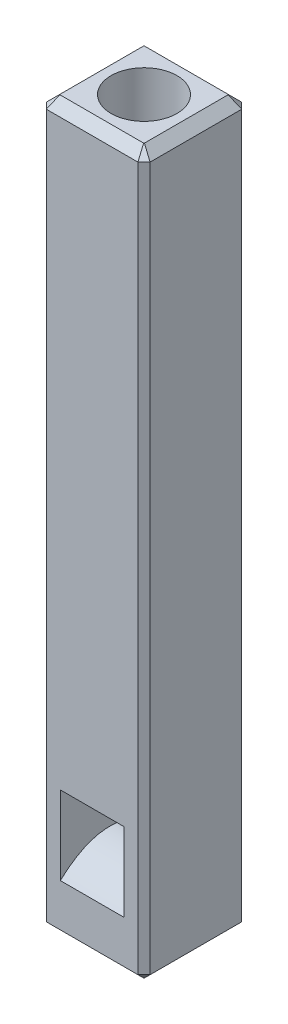
ISO-10303-21;
HEADER;
FILE_DESCRIPTION(('STEP AP214'),'2;1');
FILE_NAME('part.step','',(''),(''),'','','');
FILE_SCHEMA(('AUTOMOTIVE_DESIGN { 1 0 10303 214 1 1 1 1 }'));
ENDSEC;
DATA;
#1=APPLICATION_CONTEXT('core data for automotive mechanical design processes');
#2=APPLICATION_PROTOCOL_DEFINITION('international standard','automotive_design',2000,#1);
#3=PRODUCT_CONTEXT('',#1,'mechanical');
#4=PRODUCT('Part','Part','',(#3));
#5=PRODUCT_RELATED_PRODUCT_CATEGORY('part','',(#4));
#6=PRODUCT_DEFINITION_FORMATION('','',#4);
#7=PRODUCT_DEFINITION_CONTEXT('part definition',#1,'design');
#8=PRODUCT_DEFINITION('design','',#6,#7);
#9=PRODUCT_DEFINITION_SHAPE('','',#8);
#10=(LENGTH_UNIT() NAMED_UNIT(*) SI_UNIT(.MILLI.,.METRE.));
#11=(NAMED_UNIT(*) PLANE_ANGLE_UNIT() SI_UNIT($,.RADIAN.));
#12=(NAMED_UNIT(*) SI_UNIT($,.STERADIAN.) SOLID_ANGLE_UNIT());
#13=UNCERTAINTY_MEASURE_WITH_UNIT(LENGTH_MEASURE(1.E-05),#10,'distance_accuracy_value','');
#14=(GEOMETRIC_REPRESENTATION_CONTEXT(3) GLOBAL_UNCERTAINTY_ASSIGNED_CONTEXT((#13)) GLOBAL_UNIT_ASSIGNED_CONTEXT((#10,
#11,#12)) REPRESENTATION_CONTEXT('',''));
#15=CARTESIAN_POINT('',(0.,0.,0.));
#16=DIRECTION('',(0.,0.,1.));
#17=DIRECTION('',(1.,0.,0.));
#18=AXIS2_PLACEMENT_3D('',#15,#16,#17);
#19=CARTESIAN_POINT('',(135.398328279042,93.0902225420057,2.20725238524841));
#20=DIRECTION('',(-1.,0.,0.));
#21=DIRECTION('',(0.,0.,1.));
#22=AXIS2_PLACEMENT_3D('',#19,#20,#21);
#23=PLANE('',#22);
#24=DIRECTION('',(0.,-1.,0.));
#25=VECTOR('',#24,1.);
#26=CARTESIAN_POINT('',(135.398328279042,89.5067604238917,4.30641993807596));
#27=LINE('',#26,#25);
#28=CARTESIAN_POINT('',(135.398328279042,89.5067604238916,4.30641993807598));
#29=VERTEX_POINT('',#28);
#30=CARTESIAN_POINT('',(135.398328279042,57.2721392427519,4.30641993807597));
#31=VERTEX_POINT('',#30);
#32=EDGE_CURVE('E11',#29,#31,#27,.T.);
#33=ORIENTED_EDGE('',*,*,#32,.F.);
#34=DIRECTION('',(0.,0.,1.));
#35=VECTOR('',#34,1.);
#36=CARTESIAN_POINT('',(135.398328279042,89.5067604238916,0.108084832420845));
#37=LINE('',#36,#35);
#38=CARTESIAN_POINT('',(135.398328279042,89.5067604238917,0.108084832420809));
#39=VERTEX_POINT('',#38);
#40=EDGE_CURVE('E347',#39,#29,#37,.T.);
#41=ORIENTED_EDGE('',*,*,#40,.F.);
#42=DIRECTION('',(0.,1.,0.));
#43=VECTOR('',#42,1.);
#44=CARTESIAN_POINT('',(135.398328279042,57.2721392427519,0.108084832420827));
#45=LINE('',#44,#43);
#46=CARTESIAN_POINT('',(135.398328279042,57.2721392427518,0.108084832420818));
#47=VERTEX_POINT('',#46);
#48=EDGE_CURVE('E223',#47,#39,#45,.T.);
#49=ORIENTED_EDGE('',*,*,#48,.F.);
#50=DIRECTION('',(0.,0.,-1.));
#51=VECTOR('',#50,1.);
#52=CARTESIAN_POINT('',(135.398328279042,57.2721392427519,4.30641993807597));
#53=LINE('',#52,#51);
#54=EDGE_CURVE('E239',#31,#47,#53,.T.);
#55=ORIENTED_EDGE('',*,*,#54,.F.);
#56=EDGE_LOOP('',(#33,#41,#49,#55));
#57=FACE_BOUND('',#56,.T.);
#58=ADVANCED_FACE('F16',(#57),#23,.T.);
#59=CARTESIAN_POINT('',(135.537536147664,53.6886771246379,4.44507546716855));
#60=DIRECTION('',(-0.70569979329208,0.,0.708510975036743));
#61=DIRECTION('',(0.,1.,0.));
#62=AXIS2_PLACEMENT_3D('',#59,#60,#61);
#63=PLANE('',#62);
#64=DIRECTION('',(0.,-1.,0.));
#65=VECTOR('',#64,1.);
#66=CARTESIAN_POINT('',(135.676744016287,89.5067604238917,4.58373099626115));
#67=LINE('',#66,#65);
#68=CARTESIAN_POINT('',(135.676744016287,89.5067604238917,4.58373099626115));
#69=VERTEX_POINT('',#68);
#70=CARTESIAN_POINT('',(135.676744016287,57.2721392427519,4.58373099626115));
#71=VERTEX_POINT('',#70);
#72=EDGE_CURVE('E266',#69,#71,#67,.T.);
#73=ORIENTED_EDGE('',*,*,#72,.F.);
#74=DIRECTION('',(0.708510975036784,0.,0.705699793292039));
#75=VECTOR('',#74,1.);
#76=CARTESIAN_POINT('',(135.398328279042,89.5067604238918,4.30641993807601));
#77=LINE('',#76,#75);
#78=EDGE_CURVE('E367',#29,#69,#77,.T.);
#79=ORIENTED_EDGE('',*,*,#78,.F.);
#80=ORIENTED_EDGE('',*,*,#32,.T.);
#81=DIRECTION('',(-0.708510975036768,0.,-0.705699793292055));
#82=VECTOR('',#81,1.);
#83=CARTESIAN_POINT('',(135.676744016287,57.2721392427519,4.58373099626118));
#84=LINE('',#83,#82);
#85=EDGE_CURVE('E27',#71,#31,#84,.T.);
#86=ORIENTED_EDGE('',*,*,#85,.F.);
#87=EDGE_LOOP('',(#73,#79,#80,#86));
#88=FACE_BOUND('',#87,.T.);
#89=ADVANCED_FACE('F509',(#88),#63,.T.);
#90=CARTESIAN_POINT('',(136.518880517288,56.6939146420422,4.60641371330662));
#91=DIRECTION('',(-0.499005109318785,-0.70710678118654,0.500992914993574));
#92=DIRECTION('',(-0.817038130343771,0.576583639695365,0.));
#93=AXIS2_PLACEMENT_3D('',#90,#91,#92);
#94=PLANE('',#93);
#95=ORIENTED_EDGE('',*,*,#85,.T.);
#96=DIRECTION('',(-0.678447398917275,0.678447398917289,0.281812444375241));
#97=VECTOR('',#96,1.);
#98=CARTESIAN_POINT('',(135.840258274913,56.8302092468804,4.12285173134683));
#99=LINE('',#98,#97);
#100=CARTESIAN_POINT('',(135.840258274913,56.8302092468804,4.12285173134683));
#101=VERTEX_POINT('',#100);
#102=EDGE_CURVE('E235',#101,#31,#99,.T.);
#103=ORIENTED_EDGE('',*,*,#102,.F.);
#104=DIRECTION('',(-0.708510975037079,0.,-0.705699793291742));
#105=VECTOR('',#104,1.);
#106=CARTESIAN_POINT('',(135.859283029084,56.8302092468804,4.14180100038966));
#107=LINE('',#106,#105);
#108=CARTESIAN_POINT('',(135.859283029084,56.8302092468804,4.14180100038962));
#109=VERTEX_POINT('',#108);
#110=EDGE_CURVE('E258',#109,#101,#107,.T.);
#111=ORIENTED_EDGE('',*,*,#110,.F.);
#112=DIRECTION('',(0.280356945350055,-0.678748842796064,-0.678748842796059));
#113=VECTOR('',#112,1.);
#114=CARTESIAN_POINT('',(135.676744016287,57.2721392427519,4.58373099626112));
#115=LINE('',#114,#113);
#116=EDGE_CURVE('E171',#71,#109,#115,.T.);
#117=ORIENTED_EDGE('',*,*,#116,.F.);
#118=EDGE_LOOP('',(#95,#103,#111,#117));
#119=FACE_BOUND('',#118,.T.);
#120=ADVANCED_FACE('F373',(#119),#94,.T.);
#121=CARTESIAN_POINT('',(135.619293276977,57.0511742448162,5.08625344864147));
#122=DIRECTION('',(-0.707106781186551,-0.707106781186544,0.));
#123=DIRECTION('',(-0.707106781186544,0.707106781186551,0.));
#124=AXIS2_PLACEMENT_3D('',#121,#122,#123);
#125=PLANE('',#124);
#126=ORIENTED_EDGE('',*,*,#54,.T.);
#127=DIRECTION('',(-0.678598344545849,0.678598344545856,-0.281084637714793));
#128=VECTOR('',#127,1.);
#129=CARTESIAN_POINT('',(135.840258274913,56.8302092468803,0.291138230330263));
#130=LINE('',#129,#128);
#131=CARTESIAN_POINT('',(135.840258274913,56.8302092468803,0.291138230330263));
#132=VERTEX_POINT('',#131);
#133=EDGE_CURVE('E220',#132,#47,#130,.T.);
#134=ORIENTED_EDGE('',*,*,#133,.F.);
#135=DIRECTION('',(0.,0.,-1.));
#136=VECTOR('',#135,1.);
#137=CARTESIAN_POINT('',(135.840258274913,56.8302092468804,4.12285173134683));
#138=LINE('',#137,#136);
#139=EDGE_CURVE('E255',#101,#132,#138,.T.);
#140=ORIENTED_EDGE('',*,*,#139,.F.);
#141=ORIENTED_EDGE('',*,*,#102,.T.);
#142=EDGE_LOOP('',(#126,#134,#140,#141));
#143=FACE_BOUND('',#142,.T.);
#144=ADVANCED_FACE('F378',(#143),#125,.T.);
#145=CARTESIAN_POINT('',(136.518880517288,90.0849850246014,4.60641371330663));
#146=DIRECTION('',(-0.499005109318767,0.70710678118656,0.500992914993563));
#147=DIRECTION('',(0.708510975036741,0.,0.705699793292082));
#148=AXIS2_PLACEMENT_3D('',#145,#146,#147);
#149=PLANE('',#148);
#150=DIRECTION('',(-0.280356945350078,-0.678748842796059,0.678748842796056));
#151=VECTOR('',#150,1.);
#152=CARTESIAN_POINT('',(135.859283029084,89.9486904197632,4.14180100038971));
#153=LINE('',#152,#151);
#154=CARTESIAN_POINT('',(135.859283029084,89.9486904197632,4.1418010003897));
#155=VERTEX_POINT('',#154);
#156=EDGE_CURVE('E291',#155,#69,#153,.T.);
#157=ORIENTED_EDGE('',*,*,#156,.F.);
#158=DIRECTION('',(0.708510975036883,0.,0.705699793291939));
#159=VECTOR('',#158,1.);
#160=CARTESIAN_POINT('',(135.840258274913,89.9486904197632,4.12285173134687));
#161=LINE('',#160,#159);
#162=CARTESIAN_POINT('',(135.840258274913,89.9486904197632,4.12285173134687));
#163=VERTEX_POINT('',#162);
#164=EDGE_CURVE('E360',#163,#155,#161,.T.);
#165=ORIENTED_EDGE('',*,*,#164,.F.);
#166=DIRECTION('',(0.678447398917273,0.6784473989173,-0.281812444375221));
#167=VECTOR('',#166,1.);
#168=CARTESIAN_POINT('',(135.398328279042,89.5067604238916,4.30641993807598));
#169=LINE('',#168,#167);
#170=EDGE_CURVE('E227',#29,#163,#169,.T.);
#171=ORIENTED_EDGE('',*,*,#170,.F.);
#172=ORIENTED_EDGE('',*,*,#78,.T.);
#173=EDGE_LOOP('',(#157,#165,#171,#172));
#174=FACE_BOUND('',#173,.T.);
#175=ADVANCED_FACE('F529',(#174),#149,.T.);
#176=CARTESIAN_POINT('',(135.619293276977,89.7277254218274,5.08625344864149));
#177=DIRECTION('',(-0.707106781186553,0.707106781186542,0.));
#178=DIRECTION('',(0.,0.,1.));
#179=AXIS2_PLACEMENT_3D('',#176,#177,#178);
#180=PLANE('',#179);
#181=ORIENTED_EDGE('',*,*,#170,.T.);
#182=DIRECTION('',(0.,0.,1.));
#183=VECTOR('',#182,1.);
#184=CARTESIAN_POINT('',(135.840258274913,89.9486904197632,0.291138230330299));
#185=LINE('',#184,#183);
#186=CARTESIAN_POINT('',(135.840258274913,89.9486904197632,0.291138230330299));
#187=VERTEX_POINT('',#186);
#188=EDGE_CURVE('E364',#187,#163,#185,.T.);
#189=ORIENTED_EDGE('',*,*,#188,.F.);
#190=DIRECTION('',(0.678598344545851,0.67859834454584,0.281084637714828));
#191=VECTOR('',#190,1.);
#192=CARTESIAN_POINT('',(135.398328279042,89.5067604238917,0.108084832420809));
#193=LINE('',#192,#191);
#194=EDGE_CURVE('E210',#39,#187,#193,.T.);
#195=ORIENTED_EDGE('',*,*,#194,.F.);
#196=ORIENTED_EDGE('',*,*,#40,.T.);
#197=EDGE_LOOP('',(#181,#189,#195,#196));
#198=FACE_BOUND('',#197,.T.);
#199=ADVANCED_FACE('F526',(#198),#180,.T.);
#200=CARTESIAN_POINT('',(135.537536147664,53.6886771246379,-0.0311230362018211));
#201=DIRECTION('',(-0.707106781186547,0.,-0.707106781186548));
#202=DIRECTION('',(-0.707106781186548,0.,0.707106781186547));
#203=AXIS2_PLACEMENT_3D('',#200,#201,#202);
#204=PLANE('',#203);
#205=ORIENTED_EDGE('',*,*,#48,.T.);
#206=DIRECTION('',(-0.707106781186607,0.,0.707106781186488));
#207=VECTOR('',#206,1.);
#208=CARTESIAN_POINT('',(135.676744016287,89.5067604238918,-0.170330904824461));
#209=LINE('',#208,#207);
#210=CARTESIAN_POINT('',(135.676744016287,89.5067604238917,-0.170330904824425));
#211=VERTEX_POINT('',#210);
#212=EDGE_CURVE('E206',#211,#39,#209,.T.);
#213=ORIENTED_EDGE('',*,*,#212,.F.);
#214=DIRECTION('',(0.,1.,0.));
#215=VECTOR('',#214,1.);
#216=CARTESIAN_POINT('',(135.676744016287,57.2721392427519,-0.170330904824407));
#217=LINE('',#216,#215);
#218=CARTESIAN_POINT('',(135.676744016287,57.2721392427519,-0.170330904824469));
#219=VERTEX_POINT('',#218);
#220=EDGE_CURVE('E228',#219,#211,#217,.T.);
#221=ORIENTED_EDGE('',*,*,#220,.F.);
#222=DIRECTION('',(0.707106781186578,0.,-0.707106781186517));
#223=VECTOR('',#222,1.);
#224=CARTESIAN_POINT('',(135.398328279042,57.2721392427518,0.108084832420818));
#225=LINE('',#224,#223);
#226=EDGE_CURVE('E215',#47,#219,#225,.T.);
#227=ORIENTED_EDGE('',*,*,#226,.F.);
#228=EDGE_LOOP('',(#205,#213,#221,#227));
#229=FACE_BOUND('',#228,.T.);
#230=ADVANCED_FACE('F390',(#229),#204,.T.);
#231=CARTESIAN_POINT('',(134.896910505721,73.3894498333218,-0.170330904824407));
#232=DIRECTION('',(0.,0.,-1.));
#233=DIRECTION('',(0.,-1.,0.));
#234=AXIS2_PLACEMENT_3D('',#231,#232,#233);
#235=PLANE('',#234);
#236=DIRECTION('',(0.,1.,0.));
#237=VECTOR('',#236,1.);
#238=CARTESIAN_POINT('',(136.320727063687,59.0012698456067,-0.170330904824407));
#239=LINE('',#238,#237);
#240=CARTESIAN_POINT('',(136.320727063687,59.0012698456067,-0.170330904824407));
#241=VERTEX_POINT('',#240);
#242=CARTESIAN_POINT('',(136.320727063687,62.7276543444831,-0.170330904824407));
#243=VERTEX_POINT('',#242);
#244=EDGE_CURVE('E267',#241,#243,#239,.T.);
#245=ORIENTED_EDGE('',*,*,#244,.F.);
#246=DIRECTION('',(-1.,0.,0.));
#247=VECTOR('',#246,1.);
#248=CARTESIAN_POINT('',(139.231096074542,59.0012698456067,-0.170330904824398));
#249=LINE('',#248,#247);
#250=CARTESIAN_POINT('',(139.231096074542,59.0012698456067,-0.170330904824416));
#251=VERTEX_POINT('',#250);
#252=EDGE_CURVE('E300',#251,#241,#249,.T.);
#253=ORIENTED_EDGE('',*,*,#252,.F.);
#254=DIRECTION('',(0.,-1.,0.));
#255=VECTOR('',#254,1.);
#256=CARTESIAN_POINT('',(139.231096074542,62.7276543444831,-0.170330904824416));
#257=LINE('',#256,#255);
#258=CARTESIAN_POINT('',(139.231096074542,62.7276543444831,-0.170330904824416));
#259=VERTEX_POINT('',#258);
#260=EDGE_CURVE('E234',#259,#251,#257,.T.);
#261=ORIENTED_EDGE('',*,*,#260,.F.);
#262=DIRECTION('',(1.,0.,0.));
#263=VECTOR('',#262,1.);
#264=CARTESIAN_POINT('',(136.320727063687,62.7276543444831,-0.170330904824407));
#265=LINE('',#264,#263);
#266=EDGE_CURVE('E350',#243,#259,#265,.T.);
#267=ORIENTED_EDGE('',*,*,#266,.F.);
#268=EDGE_LOOP('',(#245,#253,#261,#267));
#269=FACE_BOUND('',#268,.T.);
#270=ORIENTED_EDGE('',*,*,#220,.T.);
#271=DIRECTION('',(-1.,0.,0.));
#272=VECTOR('',#271,1.);
#273=CARTESIAN_POINT('',(139.875079121942,89.5067604238917,-0.170330904824425));
#274=LINE('',#273,#272);
#275=CARTESIAN_POINT('',(139.875079121942,89.5067604238917,-0.170330904824425));
#276=VERTEX_POINT('',#275);
#277=EDGE_CURVE('E272',#276,#211,#274,.T.);
#278=ORIENTED_EDGE('',*,*,#277,.F.);
#279=DIRECTION('',(0.,1.,0.));
#280=VECTOR('',#279,1.);
#281=CARTESIAN_POINT('',(139.875079121942,57.2721392427519,-0.170330904824452));
#282=LINE('',#281,#280);
#283=CARTESIAN_POINT('',(139.875079121942,57.2721392427518,-0.170330904824496));
#284=VERTEX_POINT('',#283);
#285=EDGE_CURVE('E304',#284,#276,#282,.T.);
#286=ORIENTED_EDGE('',*,*,#285,.F.);
#287=DIRECTION('',(1.,0.,0.));
#288=VECTOR('',#287,1.);
#289=CARTESIAN_POINT('',(135.676744016287,57.2721392427519,-0.170330904824469));
#290=LINE('',#289,#288);
#291=EDGE_CURVE('E175',#219,#284,#290,.T.);
#292=ORIENTED_EDGE('',*,*,#291,.F.);
#293=EDGE_LOOP('',(#270,#278,#286,#292));
#294=FACE_BOUND('',#293,.T.);
#295=ADVANCED_FACE('F489',(#269,#294),#235,.T.);
#296=CARTESIAN_POINT('',(137.775911642106,56.8302092468804,-0.47542109988723));
#297=DIRECTION('',(0.,-1.,0.));
#298=DIRECTION('',(-1.,0.,0.));
#299=AXIS2_PLACEMENT_3D('',#296,#297,#298);
#300=PLANE('',#299);
#301=ORIENTED_EDGE('',*,*,#110,.T.);
#302=ORIENTED_EDGE('',*,*,#139,.T.);
#303=DIRECTION('',(-0.707106781186954,6.42936799361537E-13,0.707106781186141));
#304=VECTOR('',#303,1.);
#305=CARTESIAN_POINT('',(135.859797414196,56.8302092468803,0.271599091046992));
#306=LINE('',#305,#304);
#307=CARTESIAN_POINT('',(135.859797414196,56.8302092468804,0.271599091047019));
#308=VERTEX_POINT('',#307);
#309=EDGE_CURVE('E216',#308,#132,#306,.T.);
#310=ORIENTED_EDGE('',*,*,#309,.F.);
#311=DIRECTION('',(-1.,0.,0.));
#312=VECTOR('',#311,1.);
#313=CARTESIAN_POINT('',(139.692025791901,56.8302092468804,0.271599091047019));
#314=LINE('',#313,#312);
#315=CARTESIAN_POINT('',(139.692025791901,56.8302092468804,0.271599091047028));
#316=VERTEX_POINT('',#315);
#317=EDGE_CURVE('E20',#316,#308,#314,.T.);
#318=ORIENTED_EDGE('',*,*,#317,.F.);
#319=DIRECTION('',(-0.707106966565837,-3.21510496739835E-13,-0.707106595807209));
#320=VECTOR('',#319,1.);
#321=CARTESIAN_POINT('',(139.711565009298,56.8302092468804,0.291138298198801));
#322=LINE('',#321,#320);
#323=CARTESIAN_POINT('',(139.711565009298,56.8302092468804,0.291138298198819));
#324=VERTEX_POINT('',#323);
#325=EDGE_CURVE('E244',#324,#316,#322,.T.);
#326=ORIENTED_EDGE('',*,*,#325,.F.);
#327=DIRECTION('',(0.,0.,-1.));
#328=VECTOR('',#327,1.);
#329=CARTESIAN_POINT('',(139.711565009298,56.8302092468804,4.12285166342286));
#330=LINE('',#329,#328);
#331=CARTESIAN_POINT('',(139.711565009298,56.8302092468804,4.12285166342284));
#332=VERTEX_POINT('',#331);
#333=EDGE_CURVE('E182',#332,#324,#330,.T.);
#334=ORIENTED_EDGE('',*,*,#333,.F.);
#335=DIRECTION('',(0.70851116004623,9.9222348705562E-13,-0.705699607545552));
#336=VECTOR('',#335,1.);
#337=CARTESIAN_POINT('',(139.692540176957,56.8302092468804,4.14180100038965));
#338=LINE('',#337,#336);
#339=CARTESIAN_POINT('',(139.692540176957,56.8302092468804,4.14180100038965));
#340=VERTEX_POINT('',#339);
#341=EDGE_CURVE('E178',#340,#332,#338,.T.);
#342=ORIENTED_EDGE('',*,*,#341,.F.);
#343=DIRECTION('',(1.,0.,0.));
#344=VECTOR('',#343,1.);
#345=CARTESIAN_POINT('',(135.859283029084,56.8302092468804,4.14180100038962));
#346=LINE('',#345,#344);
#347=EDGE_CURVE('E163',#109,#340,#346,.T.);
#348=ORIENTED_EDGE('',*,*,#347,.F.);
#349=EDGE_LOOP('',(#301,#302,#310,#318,#326,#334,#342,#348));
#350=FACE_BOUND('',#349,.T.);
#351=ADVANCED_FACE('F179',(#350),#300,.T.);
#352=CARTESIAN_POINT('',(135.947391824955,57.5013594032759,-0.765144973275422));
#353=DIRECTION('',(-0.500000000000013,-0.707106781186534,-0.500000000000006));
#354=DIRECTION('',(-0.816496580927714,0.577350269189643,0.));
#355=AXIS2_PLACEMENT_3D('',#352,#353,#354);
#356=PLANE('',#355);
#357=ORIENTED_EDGE('',*,*,#226,.T.);
#358=DIRECTION('',(-0.281084637714869,0.678598344545843,-0.678598344545831));
#359=VECTOR('',#358,1.);
#360=CARTESIAN_POINT('',(135.859797414196,56.8302092468804,0.27159909104701));
#361=LINE('',#360,#359);
#362=EDGE_CURVE('E211',#308,#219,#361,.T.);
#363=ORIENTED_EDGE('',*,*,#362,.F.);
#364=ORIENTED_EDGE('',*,*,#309,.T.);
#365=ORIENTED_EDGE('',*,*,#133,.T.);
#366=EDGE_LOOP('',(#357,#363,#364,#365));
#367=FACE_BOUND('',#366,.T.);
#368=ADVANCED_FACE('F387',(#367),#356,.T.);
#369=CARTESIAN_POINT('',(134.896910505721,57.0511742448161,0.0506340931112703));
#370=DIRECTION('',(0.,-0.707106781186541,-0.707106781186554));
#371=DIRECTION('',(0.,-0.707106781186554,0.707106781186541));
#372=AXIS2_PLACEMENT_3D('',#369,#370,#371);
#373=PLANE('',#372);
#374=ORIENTED_EDGE('',*,*,#291,.T.);
#375=DIRECTION('',(0.281084541734252,0.678598364424007,-0.678598364424133));
#376=VECTOR('',#375,1.);
#377=CARTESIAN_POINT('',(139.692025791901,56.8302092468804,0.271599091047028));
#378=LINE('',#377,#376);
#379=EDGE_CURVE('E240',#316,#284,#378,.T.);
#380=ORIENTED_EDGE('',*,*,#379,.F.);
#381=ORIENTED_EDGE('',*,*,#317,.T.);
#382=ORIENTED_EDGE('',*,*,#362,.T.);
#383=EDGE_LOOP('',(#374,#380,#381,#382));
#384=FACE_BOUND('',#383,.T.);
#385=ADVANCED_FACE('F615',(#384),#373,.T.);
#386=CARTESIAN_POINT('',(134.896910505721,57.0511742448162,4.36276599832537));
#387=DIRECTION('',(0.,-0.707106781186542,0.707106781186553));
#388=DIRECTION('',(-1.,0.,0.));
#389=AXIS2_PLACEMENT_3D('',#386,#387,#388);
#390=PLANE('',#389);
#391=DIRECTION('',(1.,0.,0.));
#392=VECTOR('',#391,1.);
#393=CARTESIAN_POINT('',(135.676744016287,57.2721392427519,4.58373099626115));
#394=LINE('',#393,#392);
#395=CARTESIAN_POINT('',(139.875079121942,57.2721392427519,4.58373099626115));
#396=VERTEX_POINT('',#395);
#397=EDGE_CURVE('E262',#71,#396,#394,.T.);
#398=ORIENTED_EDGE('',*,*,#397,.F.);
#399=ORIENTED_EDGE('',*,*,#116,.T.);
#400=ORIENTED_EDGE('',*,*,#347,.T.);
#401=DIRECTION('',(-0.280356849385352,-0.678748862615148,-0.678748862615152));
#402=VECTOR('',#401,1.);
#403=CARTESIAN_POINT('',(139.875079121942,57.2721392427519,4.58373099626115));
#404=LINE('',#403,#402);
#405=EDGE_CURVE('E168',#396,#340,#404,.T.);
#406=ORIENTED_EDGE('',*,*,#405,.F.);
#407=EDGE_LOOP('',(#398,#399,#400,#406));
#408=FACE_BOUND('',#407,.T.);
#409=ADVANCED_FACE('F166',(#408),#390,.T.);
#410=CARTESIAN_POINT('',(136.519330632138,90.0863838813325,-0.193206166093036));
#411=DIRECTION('',(-0.499999999999994,0.707106781186556,-0.5));
#412=DIRECTION('',(-0.707106781186548,0.,0.707106781186547));
#413=AXIS2_PLACEMENT_3D('',#410,#411,#412);
#414=PLANE('',#413);
#415=ORIENTED_EDGE('',*,*,#194,.T.);
#416=DIRECTION('',(-0.707106781187572,0.,0.707106781185523));
#417=VECTOR('',#416,1.);
#418=CARTESIAN_POINT('',(135.859797414196,89.9486904197632,0.271599091047054));
#419=LINE('',#418,#417);
#420=CARTESIAN_POINT('',(135.859797414196,89.9486904197632,0.271599091047081));
#421=VERTEX_POINT('',#420);
#422=EDGE_CURVE('E399',#421,#187,#419,.T.);
#423=ORIENTED_EDGE('',*,*,#422,.F.);
#424=DIRECTION('',(0.281084637714877,0.678598344545838,0.678598344545832));
#425=VECTOR('',#424,1.);
#426=CARTESIAN_POINT('',(135.676744016287,89.5067604238917,-0.170330904824416));
#427=LINE('',#426,#425);
#428=EDGE_CURVE('E281',#211,#421,#427,.T.);
#429=ORIENTED_EDGE('',*,*,#428,.F.);
#430=ORIENTED_EDGE('',*,*,#212,.T.);
#431=EDGE_LOOP('',(#415,#423,#429,#430));
#432=FACE_BOUND('',#431,.T.);
#433=ADVANCED_FACE('F517',(#432),#414,.T.);
#434=CARTESIAN_POINT('',(134.896910505721,89.7277254218275,0.0506340931113236));
#435=DIRECTION('',(0.,0.707106781186544,-0.707106781186551));
#436=DIRECTION('',(-1.,0.,0.));
#437=AXIS2_PLACEMENT_3D('',#434,#435,#436);
#438=PLANE('',#437);
#439=ORIENTED_EDGE('',*,*,#428,.T.);
#440=DIRECTION('',(-1.,0.,0.));
#441=VECTOR('',#440,1.);
#442=CARTESIAN_POINT('',(139.692025791901,89.9486904197632,0.271599091047081));
#443=LINE('',#442,#441);
#444=CARTESIAN_POINT('',(139.692025791901,89.9486904197632,0.271599091047081));
#445=VERTEX_POINT('',#444);
#446=EDGE_CURVE('E431',#445,#421,#443,.T.);
#447=ORIENTED_EDGE('',*,*,#446,.F.);
#448=DIRECTION('',(-0.281084541734225,0.678598364424051,0.6785983644241));
#449=VECTOR('',#448,1.);
#450=CARTESIAN_POINT('',(139.875079121942,89.5067604238917,-0.170330904824425));
#451=LINE('',#450,#449);
#452=EDGE_CURVE('E245',#276,#445,#451,.T.);
#453=ORIENTED_EDGE('',*,*,#452,.F.);
#454=ORIENTED_EDGE('',*,*,#277,.T.);
#455=EDGE_LOOP('',(#439,#447,#453,#454));
#456=FACE_BOUND('',#455,.T.);
#457=ADVANCED_FACE('F533',(#456),#438,.T.);
#458=CARTESIAN_POINT('',(134.896910505721,89.7277254218275,4.36276599832544));
#459=DIRECTION('',(0.,0.707106781186545,0.70710678118655));
#460=DIRECTION('',(1.,0.,0.));
#461=AXIS2_PLACEMENT_3D('',#458,#459,#460);
#462=PLANE('',#461);
#463=DIRECTION('',(0.280356849385365,-0.678748862615108,0.678748862615186));
#464=VECTOR('',#463,1.);
#465=CARTESIAN_POINT('',(139.692540176957,89.9486904197632,4.14180100038966));
#466=LINE('',#465,#464);
#467=CARTESIAN_POINT('',(139.692540176957,89.9486904197632,4.14180100038966));
#468=VERTEX_POINT('',#467);
#469=CARTESIAN_POINT('',(139.875079121942,89.5067604238917,4.58373099626116));
#470=VERTEX_POINT('',#469);
#471=EDGE_CURVE('E351',#468,#470,#466,.T.);
#472=ORIENTED_EDGE('',*,*,#471,.F.);
#473=DIRECTION('',(1.,0.,0.));
#474=VECTOR('',#473,1.);
#475=CARTESIAN_POINT('',(135.859283029084,89.9486904197632,4.1418010003897));
#476=LINE('',#475,#474);
#477=EDGE_CURVE('E265',#155,#468,#476,.T.);
#478=ORIENTED_EDGE('',*,*,#477,.F.);
#479=ORIENTED_EDGE('',*,*,#156,.T.);
#480=DIRECTION('',(-1.,0.,0.));
#481=VECTOR('',#480,1.);
#482=CARTESIAN_POINT('',(139.875079121942,89.5067604238917,4.58373099626115));
#483=LINE('',#482,#481);
#484=EDGE_CURVE('E313',#470,#69,#483,.T.);
#485=ORIENTED_EDGE('',*,*,#484,.F.);
#486=EDGE_LOOP('',(#472,#478,#479,#485));
#487=FACE_BOUND('',#486,.T.);
#488=ADVANCED_FACE('F535',(#487),#462,.T.);
#489=CARTESIAN_POINT('',(137.775911642106,89.9486904197632,-0.475421099887212));
#490=DIRECTION('',(0.,1.,0.));
#491=DIRECTION('',(0.,0.,-1.));
#492=AXIS2_PLACEMENT_3D('',#489,#490,#491);
#493=PLANE('',#492);
#494=CARTESIAN_POINT('',(137.775911642106,89.9486904197632,2.20725238524841));
#495=DIRECTION('',(0.,-1.,0.));
#496=DIRECTION('',(-1.,0.,0.));
#497=AXIS2_PLACEMENT_3D('',#494,#495,#496);
#498=CIRCLE('',#497,1.5072374845181);
#499=CARTESIAN_POINT('',(139.283149126624,89.9486904197632,2.20725238524841));
#500=VERTEX_POINT('',#499);
#501=EDGE_CURVE('E318',#500,#500,#498,.T.);
#502=ORIENTED_EDGE('',*,*,#501,.T.);
#503=EDGE_LOOP('',(#502));
#504=FACE_BOUND('',#503,.T.);
#505=ORIENTED_EDGE('',*,*,#477,.T.);
#506=DIRECTION('',(-0.708511160045528,1.65471408331907E-13,0.705699607546256));
#507=VECTOR('',#506,1.);
#508=CARTESIAN_POINT('',(139.711565009298,89.9486904197632,4.12285166342283));
#509=LINE('',#508,#507);
#510=CARTESIAN_POINT('',(139.711565009298,89.9486904197632,4.12285166342283));
#511=VERTEX_POINT('',#510);
#512=EDGE_CURVE('E354',#511,#468,#509,.T.);
#513=ORIENTED_EDGE('',*,*,#512,.F.);
#514=DIRECTION('',(0.,0.,1.));
#515=VECTOR('',#514,1.);
#516=CARTESIAN_POINT('',(139.711565009298,89.9486904197632,0.291138298198836));
#517=LINE('',#516,#515);
#518=CARTESIAN_POINT('',(139.711565009298,89.9486904197632,0.291138298198836));
#519=VERTEX_POINT('',#518);
#520=EDGE_CURVE('E250',#519,#511,#517,.T.);
#521=ORIENTED_EDGE('',*,*,#520,.F.);
#522=DIRECTION('',(0.707106966565935,-3.21337305574037E-13,0.707106595807111));
#523=VECTOR('',#522,1.);
#524=CARTESIAN_POINT('',(139.692025791901,89.9486904197632,0.271599091047081));
#525=LINE('',#524,#523);
#526=EDGE_CURVE('E249',#445,#519,#525,.T.);
#527=ORIENTED_EDGE('',*,*,#526,.F.);
#528=ORIENTED_EDGE('',*,*,#446,.T.);
#529=ORIENTED_EDGE('',*,*,#422,.T.);
#530=ORIENTED_EDGE('',*,*,#188,.T.);
#531=ORIENTED_EDGE('',*,*,#164,.T.);
#532=EDGE_LOOP('',(#505,#513,#521,#527,#528,#529,#530,#531));
#533=FACE_BOUND('',#532,.T.);
#534=ADVANCED_FACE('F18',(#504,#533),#493,.T.);
#535=CARTESIAN_POINT('',(134.896910505721,73.3894498333218,4.58373099626115));
#536=DIRECTION('',(0.,0.,1.));
#537=DIRECTION('',(0.,-1.,0.));
#538=AXIS2_PLACEMENT_3D('',#535,#536,#537);
#539=PLANE('',#538);
#540=DIRECTION('',(1.,0.,0.));
#541=VECTOR('',#540,1.);
#542=CARTESIAN_POINT('',(136.320727063687,59.2296767858451,4.58373099626118));
#543=LINE('',#542,#541);
#544=CARTESIAN_POINT('',(136.320727063687,59.2296767858451,4.58373099626115));
#545=VERTEX_POINT('',#544);
#546=CARTESIAN_POINT('',(139.231096074542,59.2296767858451,4.58373099626116));
#547=VERTEX_POINT('',#546);
#548=EDGE_CURVE('E305',#545,#547,#543,.T.);
#549=ORIENTED_EDGE('',*,*,#548,.F.);
#550=DIRECTION('',(0.,-1.,0.));
#551=VECTOR('',#550,1.);
#552=CARTESIAN_POINT('',(136.320727063687,62.8271223471227,4.58373099626115));
#553=LINE('',#552,#551);
#554=CARTESIAN_POINT('',(136.320727063687,62.8271223471227,4.58373099626115));
#555=VERTEX_POINT('',#554);
#556=EDGE_CURVE('E201',#555,#545,#553,.T.);
#557=ORIENTED_EDGE('',*,*,#556,.F.);
#558=DIRECTION('',(-1.,0.,0.));
#559=VECTOR('',#558,1.);
#560=CARTESIAN_POINT('',(139.231096074542,62.8271223471227,4.58373099626117));
#561=LINE('',#560,#559);
#562=CARTESIAN_POINT('',(139.231096074542,62.8271223471227,4.58373099626116));
#563=VERTEX_POINT('',#562);
#564=EDGE_CURVE('E233',#563,#555,#561,.T.);
#565=ORIENTED_EDGE('',*,*,#564,.F.);
#566=DIRECTION('',(0.,1.,0.));
#567=VECTOR('',#566,1.);
#568=CARTESIAN_POINT('',(139.231096074542,59.2296767858451,4.58373099626116));
#569=LINE('',#568,#567);
#570=EDGE_CURVE('E270',#547,#563,#569,.T.);
#571=ORIENTED_EDGE('',*,*,#570,.F.);
#572=EDGE_LOOP('',(#549,#557,#565,#571));
#573=FACE_BOUND('',#572,.T.);
#574=DIRECTION('',(0.,-1.,0.));
#575=VECTOR('',#574,1.);
#576=CARTESIAN_POINT('',(139.875079121942,89.5067604238917,4.58373099626117));
#577=LINE('',#576,#575);
#578=EDGE_CURVE('E309',#470,#396,#577,.T.);
#579=ORIENTED_EDGE('',*,*,#578,.F.);
#580=ORIENTED_EDGE('',*,*,#484,.T.);
#581=ORIENTED_EDGE('',*,*,#72,.T.);
#582=ORIENTED_EDGE('',*,*,#397,.T.);
#583=EDGE_LOOP('',(#579,#580,#581,#582));
#584=FACE_BOUND('',#583,.T.);
#585=ADVANCED_FACE('F479',(#573,#584),#539,.T.);
#586=CARTESIAN_POINT('',(140.014287063556,53.6886771246379,4.44507546716857));
#587=DIRECTION('',(0.705699607546374,0.,0.708511160045411));
#588=DIRECTION('',(0.,-1.,0.));
#589=AXIS2_PLACEMENT_3D('',#586,#587,#588);
#590=PLANE('',#589);
#591=DIRECTION('',(0.,-1.,0.));
#592=VECTOR('',#591,1.);
#593=CARTESIAN_POINT('',(140.153495005169,89.5067604238917,4.30641993807599));
#594=LINE('',#593,#592);
#595=CARTESIAN_POINT('',(140.153495005169,89.5067604238917,4.30641993807599));
#596=VERTEX_POINT('',#595);
#597=CARTESIAN_POINT('',(140.153495005169,57.2721392427519,4.30641993807599));
#598=VERTEX_POINT('',#597);
#599=EDGE_CURVE('E321',#596,#598,#594,.T.);
#600=ORIENTED_EDGE('',*,*,#599,.F.);
#601=DIRECTION('',(0.70851116004539,0.,-0.705699607546396));
#602=VECTOR('',#601,1.);
#603=CARTESIAN_POINT('',(139.875079121942,89.5067604238917,4.58373099626116));
#604=LINE('',#603,#602);
#605=EDGE_CURVE('E294',#470,#596,#604,.T.);
#606=ORIENTED_EDGE('',*,*,#605,.F.);
#607=ORIENTED_EDGE('',*,*,#578,.T.);
#608=DIRECTION('',(-0.708511160045421,0.,0.705699607546364));
#609=VECTOR('',#608,1.);
#610=CARTESIAN_POINT('',(140.153495005169,57.2721392427519,4.30641993807599));
#611=LINE('',#610,#609);
#612=EDGE_CURVE('E191',#598,#396,#611,.T.);
#613=ORIENTED_EDGE('',*,*,#612,.F.);
#614=EDGE_LOOP('',(#600,#606,#607,#613));
#615=FACE_BOUND('',#614,.T.);
#616=ADVANCED_FACE('F532',(#615),#590,.T.);
#617=CARTESIAN_POINT('',(140.014287063556,53.6886771246379,-0.0311230362017856));
#618=DIRECTION('',(0.707106595807486,0.,-0.70710696656556));
#619=DIRECTION('',(0.,-1.,0.));
#620=AXIS2_PLACEMENT_3D('',#617,#618,#619);
#621=PLANE('',#620);
#622=ORIENTED_EDGE('',*,*,#285,.T.);
#623=DIRECTION('',(-0.707106966565582,0.,-0.707106595807465));
#624=VECTOR('',#623,1.);
#625=CARTESIAN_POINT('',(140.153495005169,89.5067604238917,0.108084832420872));
#626=LINE('',#625,#624);
#627=CARTESIAN_POINT('',(140.153495005169,89.5067604238917,0.108084832420827));
#628=VERTEX_POINT('',#627);
#629=EDGE_CURVE('E197',#628,#276,#626,.T.);
#630=ORIENTED_EDGE('',*,*,#629,.F.);
#631=DIRECTION('',(0.,1.,0.));
#632=VECTOR('',#631,1.);
#633=CARTESIAN_POINT('',(140.153495005169,57.2721392427519,0.108084832420836));
#634=LINE('',#633,#632);
#635=CARTESIAN_POINT('',(140.153495005169,57.2721392427519,0.108084832420836));
#636=VERTEX_POINT('',#635);
#637=EDGE_CURVE('E335',#636,#628,#634,.T.);
#638=ORIENTED_EDGE('',*,*,#637,.F.);
#639=DIRECTION('',(0.707106966565578,0.,0.707106595807468));
#640=VECTOR('',#639,1.);
#641=CARTESIAN_POINT('',(139.875079121942,57.2721392427518,-0.170330904824496));
#642=LINE('',#641,#640);
#643=EDGE_CURVE('E254',#284,#636,#642,.T.);
#644=ORIENTED_EDGE('',*,*,#643,.F.);
#645=EDGE_LOOP('',(#622,#630,#638,#644));
#646=FACE_BOUND('',#645,.T.);
#647=ADVANCED_FACE('F592',(#646),#621,.T.);
#648=CARTESIAN_POINT('',(139.231096074542,58.2425431542505,-0.812777670703317));
#649=CARTESIAN_POINT('',(135.738653261517,58.2425431542505,-0.812777670703317));
#650=CARTESIAN_POINT('',(139.231096074542,62.433786515522,2.3235191643104));
#651=CARTESIAN_POINT('',(135.738653261517,62.433786515522,2.3235191643104));
#652=CARTESIAN_POINT('',(139.231096074542,58.2425431542505,5.45981599932412));
#653=CARTESIAN_POINT('',(135.738653261517,58.2425431542505,5.45981599932412));
#654=(BOUNDED_SURFACE() B_SPLINE_SURFACE(2,1,((#648,#649),(#650,#651),(#652,#653)),
.UNSPECIFIED.,.F.,.F.,.F.) B_SPLINE_SURFACE_WITH_KNOTS((3,3),(2,2),(3.75652688700788,
10.0392297890017),(0.,0.349244281302516),
.UNSPECIFIED.) GEOMETRIC_REPRESENTATION_ITEM() RATIONAL_B_SPLINE_SURFACE(((1.,1.),
(0.923294594185892,0.923294594185892),(1.,1.))) REPRESENTATION_ITEM('') SURFACE());
#655=CARTESIAN_POINT('',(139.231096074542,34.0237955464782,2.3235191643103));
#656=DIRECTION('',(1.,0.,0.));
#657=DIRECTION('',(0.,-1.,0.));
#658=AXIS2_PLACEMENT_3D('',#655,#656,#657);
#659=ELLIPSE('',#658,26.2307910825877,8.16547151932337);
#660=EDGE_CURVE('E229',#251,#547,#659,.T.);
#661=CARTESIAN_POINT('',(136.320727063687,34.0237955464789,2.32351916431034));
#662=DIRECTION('',(-1.,0.,0.));
#663=DIRECTION('',(0.,1.,0.));
#664=AXIS2_PLACEMENT_3D('',#661,#662,#663);
#665=ELLIPSE('',#664,26.2307910825869,8.16547151932325);
#666=EDGE_CURVE('E204',#545,#241,#665,.T.);
#667=ORIENTED_EDGE('',*,*,#548,.T.);
#668=ORIENTED_EDGE('',*,*,#660,.F.);
#669=ORIENTED_EDGE('',*,*,#252,.T.);
#670=ORIENTED_EDGE('',*,*,#666,.F.);
#671=EDGE_LOOP('',(#667,#668,#669,#670));
#672=FACE_BOUND('',#671,.T.);
#673=ADVANCED_FACE('F491',(#672),#654,.F.);
#674=CARTESIAN_POINT('',(139.231096074542,62.3928398586588,5.46742780127678));
#675=CARTESIAN_POINT('',(135.738653261517,62.3928398586588,5.46742780127678));
#676=CARTESIAN_POINT('',(139.231096074542,64.227349569127,2.3235191643104));
#677=CARTESIAN_POINT('',(135.738653261517,64.227349569127,2.3235191643104));
#678=CARTESIAN_POINT('',(139.231096074542,62.3928398586588,-0.820389472655991));
#679=CARTESIAN_POINT('',(135.738653261517,62.3928398586588,-0.820389472655991));
#680=(BOUNDED_SURFACE() B_SPLINE_SURFACE(2,1,((#674,#675),(#676,#677),(#678,#679)),
.UNSPECIFIED.,.F.,.F.,.F.) B_SPLINE_SURFACE_WITH_KNOTS((3,3),(2,2),(13.7957566760096,
20.0784595780034),(0.,0.349244281302516),
.UNSPECIFIED.) GEOMETRIC_REPRESENTATION_ITEM() RATIONAL_B_SPLINE_SURFACE(((1.,1.),
(0.923294594185892,0.923294594185892),(1.,1.))) REPRESENTATION_ITEM('') SURFACE());
#681=CARTESIAN_POINT('',(136.320727063687,51.7922796353124,2.32351916431032));
#682=DIRECTION('',(1.,0.,0.));
#683=DIRECTION('',(0.,-1.,0.));
#684=AXIS2_PLACEMENT_3D('',#681,#682,#683);
#685=ELLIPSE('',#684,11.4812328482147,8.18528914352494);
#686=EDGE_CURVE('E205',#243,#555,#685,.T.);
#687=CARTESIAN_POINT('',(139.231096074542,51.7922796353111,2.32351916431031));
#688=DIRECTION('',(-1.,0.,0.));
#689=DIRECTION('',(0.,1.,0.));
#690=AXIS2_PLACEMENT_3D('',#687,#688,#689);
#691=ELLIPSE('',#690,11.481232848216,8.1852891435254);
#692=EDGE_CURVE('E359',#563,#259,#691,.T.);
#693=ORIENTED_EDGE('',*,*,#564,.T.);
#694=ORIENTED_EDGE('',*,*,#686,.F.);
#695=ORIENTED_EDGE('',*,*,#266,.T.);
#696=ORIENTED_EDGE('',*,*,#692,.F.);
#697=EDGE_LOOP('',(#693,#694,#695,#696));
#698=FACE_BOUND('',#697,.T.);
#699=ADVANCED_FACE('F485',(#698),#680,.F.);
#700=CARTESIAN_POINT('',(139.231096074542,64.628184305085,2.20670004571837));
#701=DIRECTION('',(-1.,0.,0.));
#702=DIRECTION('',(0.,0.,1.));
#703=AXIS2_PLACEMENT_3D('',#700,#701,#702);
#704=PLANE('',#703);
#705=ORIENTED_EDGE('',*,*,#570,.T.);
#706=ORIENTED_EDGE('',*,*,#692,.T.);
#707=ORIENTED_EDGE('',*,*,#260,.T.);
#708=ORIENTED_EDGE('',*,*,#660,.T.);
#709=EDGE_LOOP('',(#705,#706,#707,#708));
#710=FACE_BOUND('',#709,.T.);
#711=ADVANCED_FACE('F475',(#710),#704,.T.);
#712=CARTESIAN_POINT('',(136.320727063687,64.628184305085,2.20670004571837));
#713=DIRECTION('',(1.,0.,0.));
#714=DIRECTION('',(0.,1.,0.));
#715=AXIS2_PLACEMENT_3D('',#712,#713,#714);
#716=PLANE('',#715);
#717=ORIENTED_EDGE('',*,*,#686,.T.);
#718=ORIENTED_EDGE('',*,*,#556,.T.);
#719=ORIENTED_EDGE('',*,*,#666,.T.);
#720=ORIENTED_EDGE('',*,*,#244,.T.);
#721=EDGE_LOOP('',(#717,#718,#719,#720));
#722=FACE_BOUND('',#721,.T.);
#723=ADVANCED_FACE('F493',(#722),#716,.T.);
#724=CARTESIAN_POINT('',(140.748309113917,57.5013592599752,0.378732657149508));
#725=DIRECTION('',(0.499999868917177,-0.707106781186594,-0.500000131082723));
#726=DIRECTION('',(0.,0.577350370097114,-0.816496509575347));
#727=AXIS2_PLACEMENT_3D('',#724,#725,#726);
#728=PLANE('',#727);
#729=ORIENTED_EDGE('',*,*,#643,.T.);
#730=DIRECTION('',(0.678598324667628,0.678598324667614,-0.28108473369537));
#731=VECTOR('',#730,1.);
#732=CARTESIAN_POINT('',(139.711565009298,56.8302092468804,0.291138298198819));
#733=LINE('',#732,#731);
#734=EDGE_CURVE('E308',#324,#636,#733,.T.);
#735=ORIENTED_EDGE('',*,*,#734,.F.);
#736=ORIENTED_EDGE('',*,*,#325,.T.);
#737=ORIENTED_EDGE('',*,*,#379,.T.);
#738=EDGE_LOOP('',(#729,#735,#736,#737));
#739=FACE_BOUND('',#738,.T.);
#740=ADVANCED_FACE('F495',(#739),#728,.T.);
#741=CARTESIAN_POINT('',(139.932530007234,57.0511742448162,5.08625344864151));
#742=DIRECTION('',(0.707106781186546,-0.707106781186549,0.));
#743=DIRECTION('',(0.,0.,-1.));
#744=AXIS2_PLACEMENT_3D('',#741,#742,#743);
#745=PLANE('',#744);
#746=DIRECTION('',(0.,0.,-1.));
#747=VECTOR('',#746,1.);
#748=CARTESIAN_POINT('',(140.153495005169,57.2721392427519,4.30641993807599));
#749=LINE('',#748,#747);
#750=EDGE_CURVE('E324',#598,#636,#749,.T.);
#751=ORIENTED_EDGE('',*,*,#750,.F.);
#752=DIRECTION('',(0.678447378980115,0.67844737898019,0.28181254037023));
#753=VECTOR('',#752,1.);
#754=CARTESIAN_POINT('',(139.711565009298,56.8302092468804,4.12285166342284));
#755=LINE('',#754,#753);
#756=EDGE_CURVE('E187',#332,#598,#755,.T.);
#757=ORIENTED_EDGE('',*,*,#756,.F.);
#758=ORIENTED_EDGE('',*,*,#333,.T.);
#759=ORIENTED_EDGE('',*,*,#734,.T.);
#760=EDGE_LOOP('',(#751,#757,#758,#759));
#761=FACE_BOUND('',#760,.T.);
#762=ADVANCED_FACE('F502',(#761),#745,.T.);
#763=CARTESIAN_POINT('',(140.748502596464,57.4999597857601,4.03532176561621));
#764=DIRECTION('',(0.499004977976725,-0.707106781186542,0.500993045814467));
#765=DIRECTION('',(-0.817038201837145,-0.576583538386871,0.));
#766=AXIS2_PLACEMENT_3D('',#763,#764,#765);
#767=PLANE('',#766);
#768=ORIENTED_EDGE('',*,*,#612,.T.);
#769=ORIENTED_EDGE('',*,*,#405,.T.);
#770=ORIENTED_EDGE('',*,*,#341,.T.);
#771=ORIENTED_EDGE('',*,*,#756,.T.);
#772=EDGE_LOOP('',(#768,#769,#770,#771));
#773=FACE_BOUND('',#772,.T.);
#774=ADVANCED_FACE('F189',(#773),#767,.T.);
#775=CARTESIAN_POINT('',(140.748309113917,89.2775404066683,0.378732657149614));
#776=DIRECTION('',(0.499999868917213,0.707106781186551,-0.500000131082748));
#777=DIRECTION('',(-0.707106966565551,0.,-0.707106595807496));
#778=AXIS2_PLACEMENT_3D('',#775,#776,#777);
#779=PLANE('',#778);
#780=ORIENTED_EDGE('',*,*,#452,.T.);
#781=ORIENTED_EDGE('',*,*,#526,.T.);
#782=DIRECTION('',(-0.678598324667621,0.678598324667624,0.281084733695361));
#783=VECTOR('',#782,1.);
#784=CARTESIAN_POINT('',(140.153495005169,89.5067604238917,0.108084832420872));
#785=LINE('',#784,#783);
#786=EDGE_CURVE('E418',#628,#519,#785,.T.);
#787=ORIENTED_EDGE('',*,*,#786,.F.);
#788=ORIENTED_EDGE('',*,*,#629,.T.);
#789=EDGE_LOOP('',(#780,#781,#787,#788));
#790=FACE_BOUND('',#789,.T.);
#791=ADVANCED_FACE('F521',(#790),#779,.T.);
#792=CARTESIAN_POINT('',(139.932530007234,89.7277254218275,-0.671748678144644));
#793=DIRECTION('',(0.707106781186544,0.707106781186551,0.));
#794=DIRECTION('',(0.,0.,-1.));
#795=AXIS2_PLACEMENT_3D('',#792,#793,#794);
#796=PLANE('',#795);
#797=ORIENTED_EDGE('',*,*,#786,.T.);
#798=ORIENTED_EDGE('',*,*,#520,.T.);
#799=DIRECTION('',(-0.678447378980136,0.678447378980156,-0.281812540370261));
#800=VECTOR('',#799,1.);
#801=CARTESIAN_POINT('',(140.153495005169,89.5067604238917,4.30641993807599));
#802=LINE('',#801,#800);
#803=EDGE_CURVE('E404',#596,#511,#802,.T.);
#804=ORIENTED_EDGE('',*,*,#803,.F.);
#805=DIRECTION('',(0.,0.,1.));
#806=VECTOR('',#805,1.);
#807=CARTESIAN_POINT('',(140.153495005169,89.5067604238917,0.108084832420872));
#808=LINE('',#807,#806);
#809=EDGE_CURVE('E325',#628,#596,#808,.T.);
#810=ORIENTED_EDGE('',*,*,#809,.F.);
#811=EDGE_LOOP('',(#797,#798,#804,#810));
#812=FACE_BOUND('',#811,.T.);
#813=ADVANCED_FACE('F523',(#812),#796,.T.);
#814=CARTESIAN_POINT('',(140.748502596464,89.2789398808835,4.03532176561624));
#815=DIRECTION('',(0.499004977976701,0.707106781186579,0.500993045814438));
#816=DIRECTION('',(0.708511160045415,0.,-0.70569960754637));
#817=AXIS2_PLACEMENT_3D('',#814,#815,#816);
#818=PLANE('',#817);
#819=ORIENTED_EDGE('',*,*,#803,.T.);
#820=ORIENTED_EDGE('',*,*,#512,.T.);
#821=ORIENTED_EDGE('',*,*,#471,.T.);
#822=ORIENTED_EDGE('',*,*,#605,.T.);
#823=EDGE_LOOP('',(#819,#820,#821,#822));
#824=FACE_BOUND('',#823,.T.);
#825=ADVANCED_FACE('F596',(#824),#818,.T.);
#826=CARTESIAN_POINT('',(137.775911642106,77.283892060827,2.20725238524841));
#827=DIRECTION('',(0.,-1.,0.));
#828=DIRECTION('',(-1.,0.,0.));
#829=AXIS2_PLACEMENT_3D('',#826,#827,#828);
#830=CYLINDRICAL_SURFACE('',#829,1.50723748451808);
#831=CARTESIAN_POINT('',(137.775911642106,64.6190937018908,2.2072523852484));
#832=DIRECTION('',(0.,1.,0.));
#833=DIRECTION('',(1.,0.,0.));
#834=AXIS2_PLACEMENT_3D('',#831,#832,#833);
#835=CIRCLE('',#834,1.5072374845181);
#836=CARTESIAN_POINT('',(139.283149126624,64.6190937018908,2.20725238524841));
#837=VERTEX_POINT('',#836);
#838=EDGE_CURVE('E319',#837,#837,#835,.T.);
#839=ORIENTED_EDGE('',*,*,#838,.F.);
#840=DIRECTION('',(0.,1.,0.));
#841=VECTOR('',#840,1.);
#842=CARTESIAN_POINT('',(139.283149126624,77.283892060827,2.20725238524842));
#843=LINE('',#842,#841);
#844=EDGE_CURVE('E314',#837,#500,#843,.T.);
#845=ORIENTED_EDGE('',*,*,#844,.T.);
#846=ORIENTED_EDGE('',*,*,#501,.F.);
#847=ORIENTED_EDGE('',*,*,#844,.F.);
#848=EDGE_LOOP('',(#839,#845,#846,#847));
#849=FACE_BOUND('',#848,.T.);
#850=ADVANCED_FACE('F622',(#849),#830,.F.);
#851=CARTESIAN_POINT('',(137.775911642106,64.6190937018908,0.038567403826697));
#852=DIRECTION('',(0.,1.,0.));
#853=DIRECTION('',(0.,0.,-1.));
#854=AXIS2_PLACEMENT_3D('',#851,#852,#853);
#855=PLANE('',#854);
#856=ORIENTED_EDGE('',*,*,#838,.T.);
#857=EDGE_LOOP('',(#856));
#858=FACE_BOUND('',#857,.T.);
#859=ADVANCED_FACE('F619',(#858),#855,.T.);
#860=CARTESIAN_POINT('',(140.153495005169,93.0902225420057,2.20725238524841));
#861=DIRECTION('',(1.,0.,0.));
#862=DIRECTION('',(0.,1.,0.));
#863=AXIS2_PLACEMENT_3D('',#860,#861,#862);
#864=PLANE('',#863);
#865=ORIENTED_EDGE('',*,*,#637,.T.);
#866=ORIENTED_EDGE('',*,*,#809,.T.);
#867=ORIENTED_EDGE('',*,*,#599,.T.);
#868=ORIENTED_EDGE('',*,*,#750,.T.);
#869=EDGE_LOOP('',(#865,#866,#867,#868));
#870=FACE_BOUND('',#869,.T.);
#871=ADVANCED_FACE('F589',(#870),#864,.T.);
#872=CLOSED_SHELL('',(#58,#89,#120,#144,#175,#199,#230,#295,#351,#368,#385,#409,#433,#457,#488,
#534,#585,#616,#647,#673,#699,#711,#723,#740,#762,#774,#791,#813,#825,#850,#859,#871));
#873=MANIFOLD_SOLID_BREP('B1',#872);
#874=ADVANCED_BREP_SHAPE_REPRESENTATION('',(#18,#873),#14);
#875=SHAPE_DEFINITION_REPRESENTATION(#9,#874);
ENDSEC;
END-ISO-10303-21;
